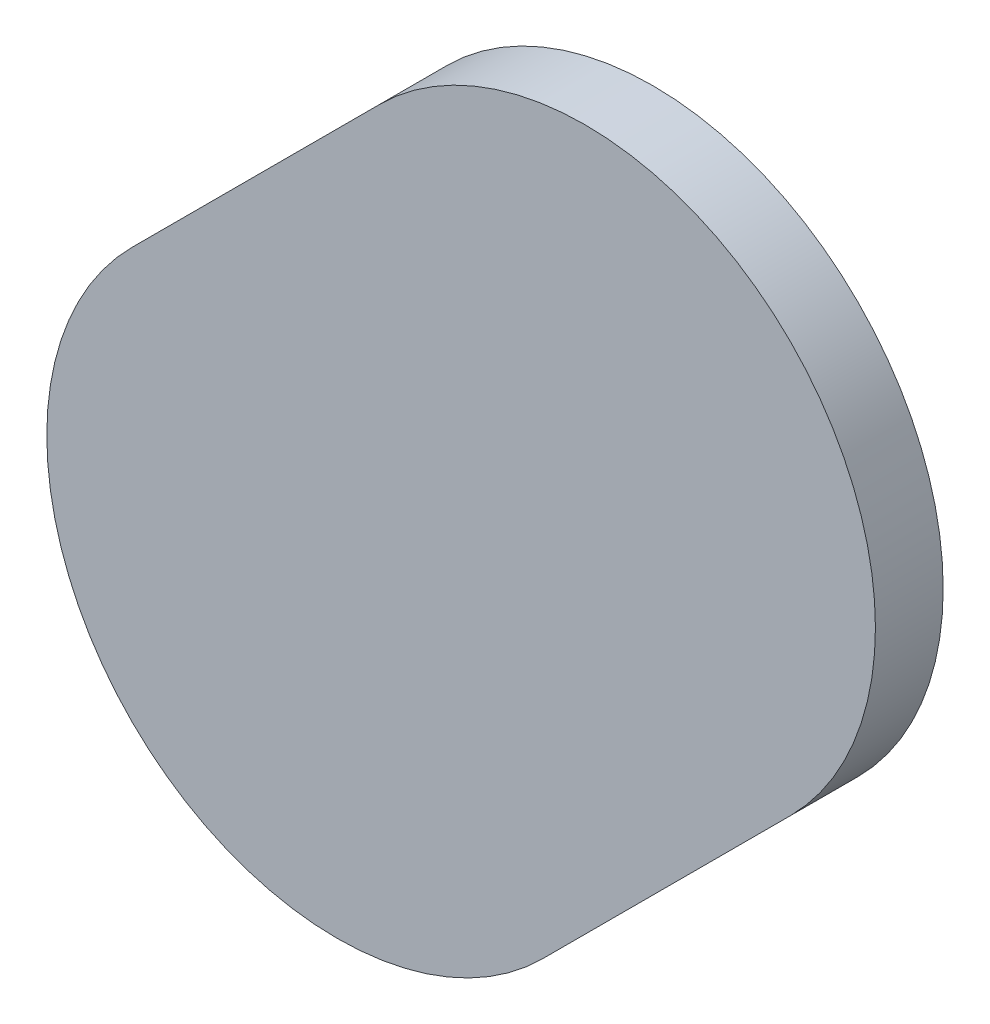
ISO-10303-21;
HEADER;
FILE_DESCRIPTION(('STEP AP214'),'2;1');
FILE_NAME('part.step','',(''),(''),'','','');
FILE_SCHEMA(('AUTOMOTIVE_DESIGN { 1 0 10303 214 1 1 1 1 }'));
ENDSEC;
DATA;
#1=APPLICATION_CONTEXT('core data for automotive mechanical design processes');
#2=APPLICATION_PROTOCOL_DEFINITION('international standard','automotive_design',2000,#1);
#3=PRODUCT_CONTEXT('',#1,'mechanical');
#4=PRODUCT('Part','Part','',(#3));
#5=PRODUCT_RELATED_PRODUCT_CATEGORY('part','',(#4));
#6=PRODUCT_DEFINITION_FORMATION('','',#4);
#7=PRODUCT_DEFINITION_CONTEXT('part definition',#1,'design');
#8=PRODUCT_DEFINITION('design','',#6,#7);
#9=PRODUCT_DEFINITION_SHAPE('','',#8);
#10=(LENGTH_UNIT() NAMED_UNIT(*) SI_UNIT(.MILLI.,.METRE.));
#11=(NAMED_UNIT(*) PLANE_ANGLE_UNIT() SI_UNIT($,.RADIAN.));
#12=(NAMED_UNIT(*) SI_UNIT($,.STERADIAN.) SOLID_ANGLE_UNIT());
#13=UNCERTAINTY_MEASURE_WITH_UNIT(LENGTH_MEASURE(1.E-05),#10,'distance_accuracy_value','');
#14=(GEOMETRIC_REPRESENTATION_CONTEXT(3) GLOBAL_UNCERTAINTY_ASSIGNED_CONTEXT((#13)) GLOBAL_UNIT_ASSIGNED_CONTEXT((#10,
#11,#12)) REPRESENTATION_CONTEXT('',''));
#15=CARTESIAN_POINT('',(0.,0.,0.));
#16=DIRECTION('',(0.,0.,1.));
#17=DIRECTION('',(1.,0.,0.));
#18=AXIS2_PLACEMENT_3D('',#15,#16,#17);
#19=CARTESIAN_POINT('',(132.146066,-119.695111,1.635));
#20=DIRECTION('',(0.,0.,1.));
#21=DIRECTION('',(1.,0.,0.));
#22=AXIS2_PLACEMENT_3D('',#19,#20,#21);
#23=PLANE('',#22);
#24=DIRECTION('',(0.707106781186548,0.707106781186548,0.));
#25=VECTOR('',#24,1.);
#26=CARTESIAN_POINT('',(132.146066,-119.695111,1.635));
#27=LINE('',#26,#25);
#28=CARTESIAN_POINT('',(132.146066,-119.695111,1.635));
#29=VERTEX_POINT('',#28);
#30=CARTESIAN_POINT('',(132.274066,-119.567111,1.635));
#31=VERTEX_POINT('',#30);
#32=EDGE_CURVE('E84',#29,#31,#27,.T.);
#33=ORIENTED_EDGE('',*,*,#32,.T.);
#34=CARTESIAN_POINT('',(132.1679995,-119.4610445,1.635));
#35=DIRECTION('',(0.,0.,1.));
#36=DIRECTION('',(0.707106781186548,-0.707106781186548,0.));
#37=AXIS2_PLACEMENT_3D('',#34,#35,#36);
#38=CIRCLE('',#37,0.150000682813);
#39=CARTESIAN_POINT('',(132.061933,-119.354978,1.635));
#40=VERTEX_POINT('',#39);
#41=EDGE_CURVE('E82',#31,#40,#38,.T.);
#42=ORIENTED_EDGE('',*,*,#41,.T.);
#43=DIRECTION('',(-0.707106781186548,-0.707106781186548,0.));
#44=VECTOR('',#43,1.);
#45=CARTESIAN_POINT('',(132.061933,-119.354978,1.635));
#46=LINE('',#45,#44);
#47=CARTESIAN_POINT('',(131.933933,-119.482978,1.635));
#48=VERTEX_POINT('',#47);
#49=EDGE_CURVE('E72',#40,#48,#46,.T.);
#50=ORIENTED_EDGE('',*,*,#49,.T.);
#51=CARTESIAN_POINT('',(132.0399995,-119.5890445,1.635));
#52=DIRECTION('',(0.,0.,1.));
#53=DIRECTION('',(-0.707106781186548,0.707106781186548,0.));
#54=AXIS2_PLACEMENT_3D('',#51,#52,#53);
#55=CIRCLE('',#54,0.150000682813);
#56=EDGE_CURVE('E11',#48,#29,#55,.T.);
#57=ORIENTED_EDGE('',*,*,#56,.T.);
#58=EDGE_LOOP('',(#33,#42,#50,#57));
#59=FACE_BOUND('',#58,.T.);
#60=ADVANCED_FACE('F17',(#59),#23,.T.);
#61=CARTESIAN_POINT('',(132.146066,-119.695111,1.6));
#62=DIRECTION('',(0.,0.,1.));
#63=DIRECTION('',(1.,0.,0.));
#64=AXIS2_PLACEMENT_3D('',#61,#62,#63);
#65=PLANE('',#64);
#66=CARTESIAN_POINT('',(132.0399995,-119.5890445,1.6));
#67=DIRECTION('',(0.,0.,1.));
#68=DIRECTION('',(-0.707106781186548,0.707106781186548,0.));
#69=AXIS2_PLACEMENT_3D('',#66,#67,#68);
#70=CIRCLE('',#69,0.150000682813);
#71=CARTESIAN_POINT('',(131.933933,-119.482978,1.6));
#72=VERTEX_POINT('',#71);
#73=CARTESIAN_POINT('',(132.146066,-119.695111,1.6));
#74=VERTEX_POINT('',#73);
#75=EDGE_CURVE('E27',#72,#74,#70,.T.);
#76=ORIENTED_EDGE('',*,*,#75,.F.);
#77=DIRECTION('',(-0.707106781186548,-0.707106781186548,0.));
#78=VECTOR('',#77,1.);
#79=CARTESIAN_POINT('',(132.061933,-119.354978,1.6));
#80=LINE('',#79,#78);
#81=CARTESIAN_POINT('',(132.061933,-119.354978,1.6));
#82=VERTEX_POINT('',#81);
#83=EDGE_CURVE('E65',#82,#72,#80,.T.);
#84=ORIENTED_EDGE('',*,*,#83,.F.);
#85=CARTESIAN_POINT('',(132.1679995,-119.4610445,1.6));
#86=DIRECTION('',(0.,0.,1.));
#87=DIRECTION('',(0.707106781186548,-0.707106781186548,0.));
#88=AXIS2_PLACEMENT_3D('',#85,#86,#87);
#89=CIRCLE('',#88,0.150000682813);
#90=CARTESIAN_POINT('',(132.274066,-119.567111,1.6));
#91=VERTEX_POINT('',#90);
#92=EDGE_CURVE('E91',#91,#82,#89,.T.);
#93=ORIENTED_EDGE('',*,*,#92,.F.);
#94=DIRECTION('',(0.707106781186548,0.707106781186548,0.));
#95=VECTOR('',#94,1.);
#96=CARTESIAN_POINT('',(132.146066,-119.695111,1.6));
#97=LINE('',#96,#95);
#98=EDGE_CURVE('E112',#74,#91,#97,.T.);
#99=ORIENTED_EDGE('',*,*,#98,.F.);
#100=EDGE_LOOP('',(#76,#84,#93,#99));
#101=FACE_BOUND('',#100,.T.);
#102=ADVANCED_FACE('F114',(#101),#65,.F.);
#103=CARTESIAN_POINT('',(132.0399995,-119.5890445,1.6));
#104=DIRECTION('',(0.,0.,-1.));
#105=DIRECTION('',(-0.707106781186548,0.707106781186548,0.));
#106=AXIS2_PLACEMENT_3D('',#103,#104,#105);
#107=CYLINDRICAL_SURFACE('',#106,0.150000682813);
#108=ORIENTED_EDGE('',*,*,#75,.T.);
#109=DIRECTION('',(0.,0.,1.));
#110=VECTOR('',#109,1.);
#111=CARTESIAN_POINT('',(132.146066,-119.695111,1.6));
#112=LINE('',#111,#110);
#113=EDGE_CURVE('E98',#74,#29,#112,.T.);
#114=ORIENTED_EDGE('',*,*,#113,.T.);
#115=ORIENTED_EDGE('',*,*,#56,.F.);
#116=DIRECTION('',(0.,0.,1.));
#117=VECTOR('',#116,1.);
#118=CARTESIAN_POINT('',(131.933933,-119.482978,1.6));
#119=LINE('',#118,#117);
#120=EDGE_CURVE('E20',#72,#48,#119,.T.);
#121=ORIENTED_EDGE('',*,*,#120,.F.);
#122=EDGE_LOOP('',(#108,#114,#115,#121));
#123=FACE_BOUND('',#122,.T.);
#124=ADVANCED_FACE('F107',(#123),#107,.T.);
#125=CARTESIAN_POINT('',(132.061933,-119.354978,1.6));
#126=DIRECTION('',(0.707106781186548,-0.707106781186548,0.));
#127=DIRECTION('',(0.,0.,-1.));
#128=AXIS2_PLACEMENT_3D('',#125,#126,#127);
#129=PLANE('',#128);
#130=ORIENTED_EDGE('',*,*,#83,.T.);
#131=ORIENTED_EDGE('',*,*,#120,.T.);
#132=ORIENTED_EDGE('',*,*,#49,.F.);
#133=DIRECTION('',(0.,0.,1.));
#134=VECTOR('',#133,1.);
#135=CARTESIAN_POINT('',(132.061933,-119.354978,1.6));
#136=LINE('',#135,#134);
#137=EDGE_CURVE('E76',#82,#40,#136,.T.);
#138=ORIENTED_EDGE('',*,*,#137,.F.);
#139=EDGE_LOOP('',(#130,#131,#132,#138));
#140=FACE_BOUND('',#139,.T.);
#141=ADVANCED_FACE('F74',(#140),#129,.F.);
#142=CARTESIAN_POINT('',(132.1679995,-119.4610445,1.6));
#143=DIRECTION('',(0.,0.,-1.));
#144=DIRECTION('',(0.707106781186548,-0.707106781186548,0.));
#145=AXIS2_PLACEMENT_3D('',#142,#143,#144);
#146=CYLINDRICAL_SURFACE('',#145,0.150000682813);
#147=ORIENTED_EDGE('',*,*,#92,.T.);
#148=ORIENTED_EDGE('',*,*,#137,.T.);
#149=ORIENTED_EDGE('',*,*,#41,.F.);
#150=DIRECTION('',(0.,0.,1.));
#151=VECTOR('',#150,1.);
#152=CARTESIAN_POINT('',(132.274066,-119.567111,1.6));
#153=LINE('',#152,#151);
#154=EDGE_CURVE('E116',#91,#31,#153,.T.);
#155=ORIENTED_EDGE('',*,*,#154,.F.);
#156=EDGE_LOOP('',(#147,#148,#149,#155));
#157=FACE_BOUND('',#156,.T.);
#158=ADVANCED_FACE('F90',(#157),#146,.T.);
#159=CARTESIAN_POINT('',(132.146066,-119.695111,1.6));
#160=DIRECTION('',(-0.707106781186548,0.707106781186548,0.));
#161=DIRECTION('',(0.,0.,1.));
#162=AXIS2_PLACEMENT_3D('',#159,#160,#161);
#163=PLANE('',#162);
#164=ORIENTED_EDGE('',*,*,#98,.T.);
#165=ORIENTED_EDGE('',*,*,#154,.T.);
#166=ORIENTED_EDGE('',*,*,#32,.F.);
#167=ORIENTED_EDGE('',*,*,#113,.F.);
#168=EDGE_LOOP('',(#164,#165,#166,#167));
#169=FACE_BOUND('',#168,.T.);
#170=ADVANCED_FACE('F111',(#169),#163,.F.);
#171=CLOSED_SHELL('',(#60,#102,#124,#141,#158,#170));
#172=MANIFOLD_SOLID_BREP('B1',#171);
#173=ADVANCED_BREP_SHAPE_REPRESENTATION('',(#18,#172),#14);
#174=SHAPE_DEFINITION_REPRESENTATION(#9,#173);
ENDSEC;
END-ISO-10303-21;
